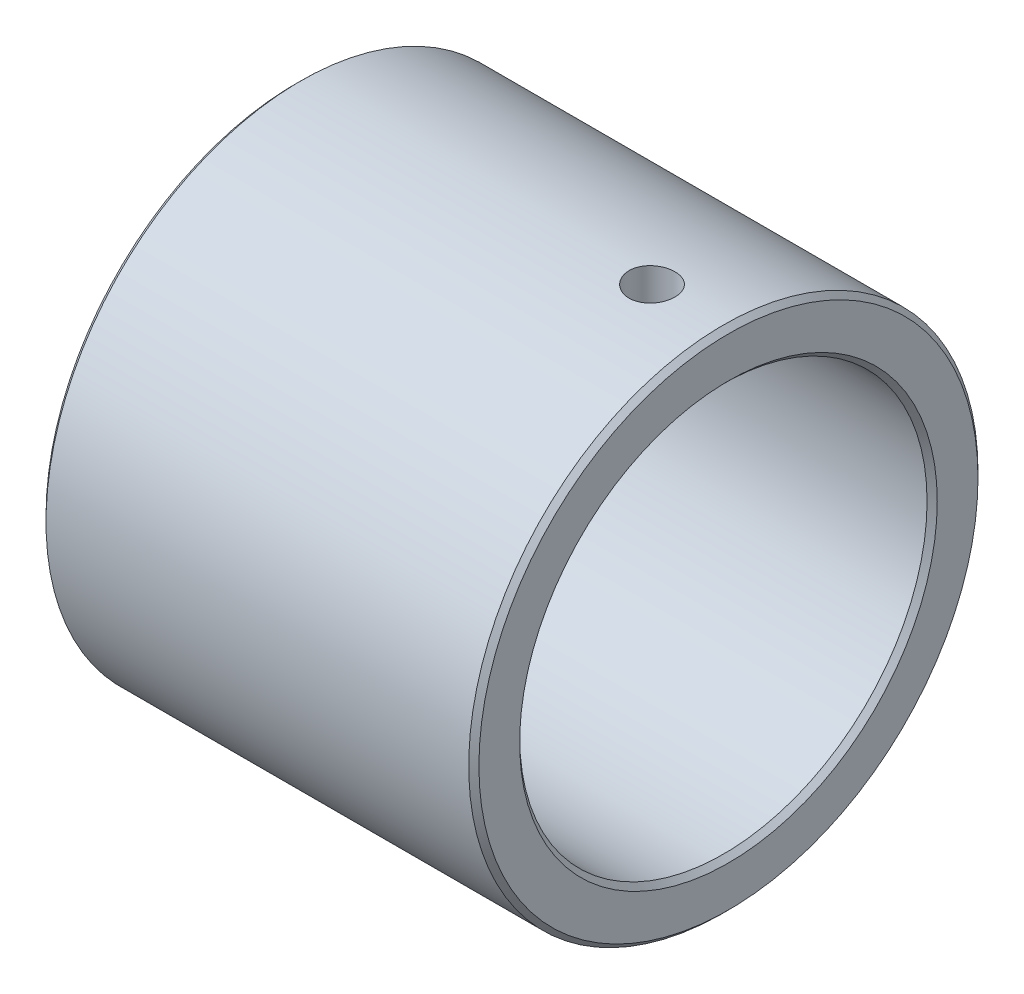
ISO-10303-21;
HEADER;
FILE_DESCRIPTION(('STEP AP214'),'2;1');
FILE_NAME('part.step','',(''),(''),'','','');
FILE_SCHEMA(('AUTOMOTIVE_DESIGN { 1 0 10303 214 1 1 1 1 }'));
ENDSEC;
DATA;
#1=APPLICATION_CONTEXT('core data for automotive mechanical design processes');
#2=APPLICATION_PROTOCOL_DEFINITION('international standard','automotive_design',2000,#1);
#3=PRODUCT_CONTEXT('',#1,'mechanical');
#4=PRODUCT('Part','Part','',(#3));
#5=PRODUCT_RELATED_PRODUCT_CATEGORY('part','',(#4));
#6=PRODUCT_DEFINITION_FORMATION('','',#4);
#7=PRODUCT_DEFINITION_CONTEXT('part definition',#1,'design');
#8=PRODUCT_DEFINITION('design','',#6,#7);
#9=PRODUCT_DEFINITION_SHAPE('','',#8);
#10=(LENGTH_UNIT() NAMED_UNIT(*) SI_UNIT(.MILLI.,.METRE.));
#11=(NAMED_UNIT(*) PLANE_ANGLE_UNIT() SI_UNIT($,.RADIAN.));
#12=(NAMED_UNIT(*) SI_UNIT($,.STERADIAN.) SOLID_ANGLE_UNIT());
#13=UNCERTAINTY_MEASURE_WITH_UNIT(LENGTH_MEASURE(1.E-05),#10,'distance_accuracy_value','');
#14=(GEOMETRIC_REPRESENTATION_CONTEXT(3) GLOBAL_UNCERTAINTY_ASSIGNED_CONTEXT((#13)) GLOBAL_UNIT_ASSIGNED_CONTEXT((#10,
#11,#12)) REPRESENTATION_CONTEXT('',''));
#15=CARTESIAN_POINT('',(0.,0.,0.));
#16=DIRECTION('',(0.,0.,1.));
#17=DIRECTION('',(1.,0.,0.));
#18=AXIS2_PLACEMENT_3D('',#15,#16,#17);
#19=CARTESIAN_POINT('',(85.,0.,0.));
#20=DIRECTION('',(1.,0.,0.));
#21=DIRECTION('',(0.,0.,-1.));
#22=AXIS2_PLACEMENT_3D('',#19,#20,#21);
#23=PLANE('',#22);
#24=CARTESIAN_POINT('',(85.,0.,0.));
#25=DIRECTION('',(1.,0.,0.));
#26=DIRECTION('',(0.,0.,-1.));
#27=AXIS2_PLACEMENT_3D('',#24,#25,#26);
#28=CIRCLE('',#27,41.);
#29=CARTESIAN_POINT('',(85.,0.,-41.));
#30=VERTEX_POINT('',#29);
#31=EDGE_CURVE('E64',#30,#30,#28,.F.);
#32=ORIENTED_EDGE('',*,*,#31,.T.);
#33=EDGE_LOOP('',(#32));
#34=FACE_BOUND('',#33,.T.);
#35=CARTESIAN_POINT('',(85.,0.,0.));
#36=DIRECTION('',(1.,0.,0.));
#37=DIRECTION('',(0.,0.,-1.));
#38=AXIS2_PLACEMENT_3D('',#35,#36,#37);
#39=CIRCLE('',#38,49.);
#40=CARTESIAN_POINT('',(85.,0.,-49.));
#41=VERTEX_POINT('',#40);
#42=EDGE_CURVE('E67',#41,#41,#39,.T.);
#43=ORIENTED_EDGE('',*,*,#42,.T.);
#44=EDGE_LOOP('',(#43));
#45=FACE_BOUND('',#44,.T.);
#46=ADVANCED_FACE('F36',(#34,#45),#23,.T.);
#47=CARTESIAN_POINT('',(0.,0.,0.));
#48=DIRECTION('',(1.,0.,0.));
#49=DIRECTION('',(0.,0.,-1.));
#50=AXIS2_PLACEMENT_3D('',#47,#48,#49);
#51=PLANE('',#50);
#52=CARTESIAN_POINT('',(0.,0.,0.));
#53=DIRECTION('',(1.,0.,0.));
#54=DIRECTION('',(0.,0.,-1.));
#55=AXIS2_PLACEMENT_3D('',#52,#53,#54);
#56=CIRCLE('',#55,41.);
#57=CARTESIAN_POINT('',(0.,0.,-41.));
#58=VERTEX_POINT('',#57);
#59=EDGE_CURVE('E48',#58,#58,#56,.T.);
#60=ORIENTED_EDGE('',*,*,#59,.T.);
#61=EDGE_LOOP('',(#60));
#62=FACE_BOUND('',#61,.T.);
#63=CARTESIAN_POINT('',(0.,0.,0.));
#64=DIRECTION('',(1.,0.,0.));
#65=DIRECTION('',(0.,0.,-1.));
#66=AXIS2_PLACEMENT_3D('',#63,#64,#65);
#67=CIRCLE('',#66,49.);
#68=CARTESIAN_POINT('',(0.,0.,-49.));
#69=VERTEX_POINT('',#68);
#70=EDGE_CURVE('E52',#69,#69,#67,.F.);
#71=ORIENTED_EDGE('',*,*,#70,.T.);
#72=EDGE_LOOP('',(#71));
#73=FACE_BOUND('',#72,.T.);
#74=ADVANCED_FACE('F97',(#62,#73),#51,.F.);
#75=CARTESIAN_POINT('',(85.,0.,0.));
#76=DIRECTION('',(-1.,0.,0.));
#77=DIRECTION('',(0.,0.,1.));
#78=AXIS2_PLACEMENT_3D('',#75,#76,#77);
#79=CYLINDRICAL_SURFACE('',#78,50.);
#80=CARTESIAN_POINT('',(70.,49.7970882682914,4.5));
#81=CARTESIAN_POINT('',(69.7477828195603,49.7970909455812,4.49998901574232));
#82=CARTESIAN_POINT('',(69.4953958003459,49.7990250856355,4.47872413144806));
#83=CARTESIAN_POINT('',(68.9976103851157,49.8065522178939,4.39421055062655));
#84=CARTESIAN_POINT('',(68.7522201479186,49.8121493128264,4.3309147758229));
#85=CARTESIAN_POINT('',(68.2757096128958,49.8263633291343,4.16418961108297));
#86=CARTESIAN_POINT('',(68.0445811034301,49.8349784933136,4.06078357060651));
#87=CARTESIAN_POINT('',(67.6030144210239,49.8542557537167,3.81681601803031));
#88=CARTESIAN_POINT('',(67.392571956222,49.8649174239781,3.67626223561904));
#89=CARTESIAN_POINT('',(66.9976726202033,49.8871219299917,3.36153887766235));
#90=CARTESIAN_POINT('',(66.8132857690383,49.8986670162332,3.18728159500766));
#91=CARTESIAN_POINT('',(66.4763338420713,49.9213169800203,2.81028416425305));
#92=CARTESIAN_POINT('',(66.3237701811293,49.9324218379756,2.60754275041835));
#93=CARTESIAN_POINT('',(66.054558454301,49.9529618480713,2.17890956671336));
#94=CARTESIAN_POINT('',(65.9379715789402,49.9623941440008,1.95297921637634));
#95=CARTESIAN_POINT('',(65.744414305935,49.9785019125345,1.48465011675435));
#96=CARTESIAN_POINT('',(65.6674431120665,49.9851774405456,1.24225169856712));
#97=CARTESIAN_POINT('',(65.5555053532911,49.9950037644823,0.748568945589706));
#98=CARTESIAN_POINT('',(65.5204247328265,49.9981641295322,0.497310665263049));
#99=CARTESIAN_POINT('',(65.4929112227566,50.0006365165153,-0.00754607600540508));
#100=CARTESIAN_POINT('',(65.5004774216505,49.9999486206984,-0.261144486815365));
#101=CARTESIAN_POINT('',(65.5579497617024,49.994809863503,-0.762709060147606));
#102=CARTESIAN_POINT('',(65.6077332563999,49.9903699024673,-1.01068940348989));
#103=CARTESIAN_POINT('',(65.7480361753584,49.9782387810855,-1.49476023342584));
#104=CARTESIAN_POINT('',(65.8385560414479,49.9705475854763,-1.73085059102927));
#105=CARTESIAN_POINT('',(66.0578980298907,49.9527602899161,-2.18482859855666));
#106=CARTESIAN_POINT('',(66.1867748322092,49.9426607608642,-2.40268968975519));
#107=CARTESIAN_POINT('',(66.4791326532763,49.9211911228025,-2.81373504263535));
#108=CARTESIAN_POINT('',(66.6426144924675,49.9098209836711,-3.0069187190718));
#109=CARTESIAN_POINT('',(67.0002324246755,49.8870396656629,-3.36384304597326));
#110=CARTESIAN_POINT('',(67.1944751351317,49.8756284841926,-3.52747689046139));
#111=CARTESIAN_POINT('',(67.6077301366836,49.8540916101512,-3.81983077722591));
#112=CARTESIAN_POINT('',(67.8267424534815,49.843965918914,-3.94855078327346));
#113=CARTESIAN_POINT('',(68.28339738582,49.8261450075227,-4.16742038049236));
#114=CARTESIAN_POINT('',(68.521042864644,49.818450161824,-4.2575640299911));
#115=CARTESIAN_POINT('',(69.008180655234,49.8063697201452,-4.39664093554174));
#116=CARTESIAN_POINT('',(69.2576726756576,49.8019840428272,-4.44557520450346));
#117=CARTESIAN_POINT('',(69.7604856369842,49.7970320779223,-4.50070825184742));
#118=CARTESIAN_POINT('',(70.0137901008338,49.7964524629098,-4.50705615366339));
#119=CARTESIAN_POINT('',(70.5178593926552,49.7991430787535,-4.47722727998323));
#120=CARTESIAN_POINT('',(70.7686242482929,49.8024132676251,-4.44105096823916));
#121=CARTESIAN_POINT('',(71.2600654409558,49.8124228855139,-4.32732506826713));
#122=CARTESIAN_POINT('',(71.5007580925942,49.8191564492455,-4.24984541990214));
#123=CARTESIAN_POINT('',(71.9657285327925,49.8353292982776,-4.05578342300488));
#124=CARTESIAN_POINT('',(72.1900060149798,49.8447686340626,-3.93920034487311));
#125=CARTESIAN_POINT('',(72.6164610858997,49.8653217543429,-3.66986493898665));
#126=CARTESIAN_POINT('',(72.8185758234097,49.8764400986335,-3.51701344834414));
#127=CARTESIAN_POINT('',(73.1943320782907,49.8990832599417,-3.17962291372337));
#128=CARTESIAN_POINT('',(73.3679730245549,49.9106080851065,-2.99508323431828));
#129=CARTESIAN_POINT('',(73.6823636620538,49.9328055522644,-2.59890935857889));
#130=CARTESIAN_POINT('',(73.823016314977,49.9434756207601,-2.38719799169619));
#131=CARTESIAN_POINT('',(74.0667712093004,49.9627241228052,-1.94307368821121));
#132=CARTESIAN_POINT('',(74.1698738792276,49.9713025802239,-1.71066098789389));
#133=CARTESIAN_POINT('',(74.3354362915076,49.9853895480291,-1.23207567066921));
#134=CARTESIAN_POINT('',(74.3979555109753,49.9909025492895,-0.985923766879016));
#135=CARTESIAN_POINT('',(74.4807706188012,49.9982557514571,-0.486564709330665));
#136=CARTESIAN_POINT('',(74.5010674527281,50.0000960346147,-0.233357713699715));
#137=CARTESIAN_POINT('',(74.4988497678809,49.9998965151497,0.271968690181564));
#138=CARTESIAN_POINT('',(74.476486253819,49.9978703984027,0.524088780234593));
#139=CARTESIAN_POINT('',(74.3898982516539,49.9901927601647,1.02097620257782));
#140=CARTESIAN_POINT('',(74.3256737149414,49.984541234464,1.26574352632959));
#141=CARTESIAN_POINT('',(74.1572265030108,49.9702465253009,1.74098291488919));
#142=CARTESIAN_POINT('',(74.0530072095183,49.9616035947806,1.97145618640612));
#143=CARTESIAN_POINT('',(73.8075456157773,49.9422916783682,2.41166020272996));
#144=CARTESIAN_POINT('',(73.66630376054,49.9316227168295,2.62139119681739));
#145=CARTESIAN_POINT('',(73.3502393049078,49.9094103145559,3.01493066715015));
#146=CARTESIAN_POINT('',(73.175304596354,49.8978640345863,3.1986489458303));
#147=CARTESIAN_POINT('',(72.7970315062044,49.8752225096701,3.53419603065372));
#148=CARTESIAN_POINT('',(72.5936862807516,49.8641273742345,3.68601713090311));
#149=CARTESIAN_POINT('',(72.1639058664326,49.8436189796934,3.95370258617575));
#150=CARTESIAN_POINT('',(71.9374225725904,49.8342093413342,4.06948991830313));
#151=CARTESIAN_POINT('',(71.468294885123,49.81818105121,4.26124167257795));
#152=CARTESIAN_POINT('',(71.2256692977527,49.8115592152928,4.33725155170795));
#153=CARTESIAN_POINT('',(70.8180280398378,49.8035468192985,4.42808437272771));
#154=CARTESIAN_POINT('',(70.6556284458143,49.8011361165538,4.45501650525101));
#155=CARTESIAN_POINT('',(70.3288433001838,49.7979059707615,4.49097787107928));
#156=CARTESIAN_POINT('',(70.1644577549992,49.7970865225693,4.50000716226529));
#157=CARTESIAN_POINT('',(70.,49.7970882682914,4.5));
#158=B_SPLINE_CURVE_WITH_KNOTS('',3,(#80,#81,#82,#83,#84,#85,#86,#87,#88,#89,#90,#91,#92,#93,
#94,#95,#96,#97,#98,#99,#100,#101,#102,#103,#104,#105,#106,#107,#108,#109,#110,#111,#112,#113,
#114,#115,#116,#117,#118,#119,#120,#121,#122,#123,#124,#125,#126,#127,#128,#129,#130,#131,#132,
#133,#134,#135,#136,#137,#138,#139,#140,#141,#142,#143,#144,#145,#146,#147,#148,#149,#150,#151,
#152,#153,#154,#155,#156,#157),.UNSPECIFIED.,.T.,.F.,(4,2,2,2,2,2,2,2,2,2,2,2,2,2,2,2,2,2,2,2,2,
2,2,2,2,2,2,2,2,2,2,2,2,2,2,2,2,2,4),(0.,0.756051036409277,1.51295034782219,2.26940970376489,
3.02571177967797,3.78400913614666,4.54234019935105,5.30195403752981,6.06155260785575,
6.81907826722582,7.57658773587787,8.33190405528276,9.08722856708215,9.84363503627465,
10.6000594409392,11.3591654365411,12.1182722198368,12.8774958815121,13.6367008812338,
14.3932460011032,15.1497828704706,15.9050427294221,16.6603166809449,17.4176799475392,
18.1750584029208,18.9346375756788,19.6942080797132,20.4526628660741,21.2111006666865,
21.9668588078972,22.7226178267002,23.4783129569611,24.2339990041803,24.9922443392693,
25.7506726452897,26.5107111453391,27.2698791793771,27.7628624800871,28.2558441869474),.UNSPECIFIED.);
#159=CARTESIAN_POINT('',(70.,49.7970882682914,4.5));
#160=VERTEX_POINT('',#159);
#161=EDGE_CURVE('E10',#160,#160,#158,.T.);
#162=ORIENTED_EDGE('',*,*,#161,.T.);
#163=EDGE_LOOP('',(#162));
#164=FACE_BOUND('',#163,.T.);
#165=CARTESIAN_POINT('',(84.,0.,0.));
#166=DIRECTION('',(1.,0.,0.));
#167=DIRECTION('',(0.,0.,-1.));
#168=AXIS2_PLACEMENT_3D('',#165,#166,#167);
#169=CIRCLE('',#168,50.);
#170=CARTESIAN_POINT('',(84.,0.,-50.));
#171=VERTEX_POINT('',#170);
#172=EDGE_CURVE('E56',#171,#171,#169,.F.);
#173=ORIENTED_EDGE('',*,*,#172,.T.);
#174=EDGE_LOOP('',(#173));
#175=FACE_BOUND('',#174,.T.);
#176=CARTESIAN_POINT('',(0.999999999999987,0.,0.));
#177=DIRECTION('',(1.,0.,0.));
#178=DIRECTION('',(0.,0.,-1.));
#179=AXIS2_PLACEMENT_3D('',#176,#177,#178);
#180=CIRCLE('',#179,50.);
#181=CARTESIAN_POINT('',(0.999999999999987,0.,-50.));
#182=VERTEX_POINT('',#181);
#183=EDGE_CURVE('E61',#182,#182,#180,.T.);
#184=ORIENTED_EDGE('',*,*,#183,.T.);
#185=EDGE_LOOP('',(#184));
#186=FACE_BOUND('',#185,.T.);
#187=ADVANCED_FACE('F102',(#164,#175,#186),#79,.T.);
#188=CARTESIAN_POINT('',(85.,0.,0.));
#189=DIRECTION('',(-1.,0.,0.));
#190=DIRECTION('',(0.,0.,1.));
#191=AXIS2_PLACEMENT_3D('',#188,#189,#190);
#192=CYLINDRICAL_SURFACE('',#191,40.);
#193=CARTESIAN_POINT('',(70.,39.7460689880144,4.5));
#194=CARTESIAN_POINT('',(69.7480926188938,39.7460722809675,4.49998917825949));
#195=CARTESIAN_POINT('',(69.4960229771268,39.748489672373,4.47877625254139));
#196=CARTESIAN_POINT('',(68.9988848780382,39.7578956183662,4.39448120169113));
#197=CARTESIAN_POINT('',(68.7538242432768,39.7648890871804,4.33135406402252));
#198=CARTESIAN_POINT('',(68.2779747072233,39.78264523958,4.16510299675445));
#199=CARTESIAN_POINT('',(68.047176775129,39.7934055087424,4.0620046831193));
#200=CARTESIAN_POINT('',(67.6062064077763,39.8174799139936,3.81878983536818));
#201=CARTESIAN_POINT('',(67.3960301563055,39.8307935762033,3.67868016829616));
#202=CARTESIAN_POINT('',(67.0012639129989,39.8585426774711,3.36473429269506));
#203=CARTESIAN_POINT('',(66.8167814407611,39.872982457982,3.1907632550704));
#204=CARTESIAN_POINT('',(66.4795668338649,39.9013175796803,2.8143223850519));
#205=CARTESIAN_POINT('',(66.3268362108361,39.9152128949215,2.6118511966031));
#206=CARTESIAN_POINT('',(66.0570816639941,39.9409371904276,2.18348961455327));
#207=CARTESIAN_POINT('',(65.940154039599,39.9527605619203,1.95753821230503));
#208=CARTESIAN_POINT('',(65.7459410235606,39.9729613010401,1.48905208848223));
#209=CARTESIAN_POINT('',(65.6686544277028,39.9813387733452,1.24651787091387));
#210=CARTESIAN_POINT('',(65.5562358287945,39.9936732692445,0.752844565905171));
#211=CARTESIAN_POINT('',(65.5209260254257,39.9976489325453,0.501746440034769));
#212=CARTESIAN_POINT('',(65.4929127611753,40.0007953857927,-0.00284099102516785));
#213=CARTESIAN_POINT('',(65.5002079251916,39.9999663308146,-0.256330218776751));
#214=CARTESIAN_POINT('',(65.5570540577609,39.993611930422,-0.757295958747963));
#215=CARTESIAN_POINT('',(65.6064138253628,39.9881078353656,-1.00479447445));
#216=CARTESIAN_POINT('',(65.7456896734463,39.9730459451045,-1.4879722825473));
#217=CARTESIAN_POINT('',(65.8356063984794,39.9634880854754,-1.72365138703642));
#218=CARTESIAN_POINT('',(66.053650406778,39.9413562943468,-2.17709791837234));
#219=CARTESIAN_POINT('',(66.1818614159301,39.9287757660532,-2.39482474980526));
#220=CARTESIAN_POINT('',(66.4727937123037,39.9020083420579,-2.80574336485208));
#221=CARTESIAN_POINT('',(66.635516281805,39.8878213866784,-2.99893423640394));
#222=CARTESIAN_POINT('',(66.9919258479528,39.859338397759,-3.35641847618246));
#223=CARTESIAN_POINT('',(67.1857793208684,39.8450421952271,-3.52054590000452));
#224=CARTESIAN_POINT('',(67.5983732375133,39.8180299561204,-3.81395718239763));
#225=CARTESIAN_POINT('',(67.8171137349708,39.8053139229572,-3.9432409657433));
#226=CARTESIAN_POINT('',(68.2734095826898,39.7829013351127,-4.16329911459418));
#227=CARTESIAN_POINT('',(68.5109706163176,39.7732056969136,-4.25406179461286));
#228=CARTESIAN_POINT('',(68.998094526414,39.75795018912,-4.39436254380214));
#229=CARTESIAN_POINT('',(69.2476569370431,39.7523901591374,-4.44390221170054));
#230=CARTESIAN_POINT('',(69.7502384786121,39.7460639865721,-4.50013425435024));
#231=CARTESIAN_POINT('',(70.0032312467523,39.7452717974205,-4.50705943541129));
#232=CARTESIAN_POINT('',(70.5067734525282,39.7485022035577,-4.47847867906871));
#233=CARTESIAN_POINT('',(70.7573229320668,39.7525247161264,-4.44297347065007));
#234=CARTESIAN_POINT('',(71.2481787954187,39.7649075674232,-4.33073516712147));
#235=CARTESIAN_POINT('',(71.4885109567526,39.7732561903548,-4.25411340236171));
#236=CARTESIAN_POINT('',(71.9529137336764,39.7933410975608,-4.06193109609873));
#237=CARTESIAN_POINT('',(72.1769838815997,39.8050774792129,-3.9463694352919));
#238=CARTESIAN_POINT('',(72.6035595426191,39.8306782716636,-3.67900961986329));
#239=CARTESIAN_POINT('',(72.8059682949104,39.8445516064736,-3.52705795036057));
#240=CARTESIAN_POINT('',(73.1824914429894,39.872834515189,-3.19145006614036));
#241=CARTESIAN_POINT('',(73.3566049500061,39.8872441059211,-3.00779285590587));
#242=CARTESIAN_POINT('',(73.6724050779625,39.9150552393907,-2.6129739360752));
#243=CARTESIAN_POINT('',(73.8139393013417,39.9284518552947,-2.4016899336736));
#244=CARTESIAN_POINT('',(74.0595118055827,39.9526549995581,-1.95821461424752));
#245=CARTESIAN_POINT('',(74.1635507167997,39.9634615714593,-1.7260236487841));
#246=CARTESIAN_POINT('',(74.3309241805024,39.9812449696974,-1.24784530374507));
#247=CARTESIAN_POINT('',(74.3943488952803,39.9882302740704,-1.00188981127613));
#248=CARTESIAN_POINT('',(74.4789874032245,39.9976190811227,-0.50273736314563));
#249=CARTESIAN_POINT('',(74.5002027206716,40.0000227492557,-0.249540669315888));
#250=CARTESIAN_POINT('',(74.4997954693064,39.9999770468032,0.255414218456674));
#251=CARTESIAN_POINT('',(74.4784087189358,39.9975543917223,0.507172637922325));
#252=CARTESIAN_POINT('',(74.393901265343,39.988181114428,1.00349461295482));
#253=CARTESIAN_POINT('',(74.3307805557501,39.9812304915233,1.24805816742337));
#254=CARTESIAN_POINT('',(74.1646665173412,39.9635793522078,1.72303237814413));
#255=CARTESIAN_POINT('',(74.0616822082705,39.9528796841273,1.95344622232853));
#256=CARTESIAN_POINT('',(73.8187888963582,39.9289193996405,2.3937569209739));
#257=CARTESIAN_POINT('',(73.6788797966084,39.9156587765132,2.6036537215864));
#258=CARTESIAN_POINT('',(73.3652288887195,39.8879718877799,2.998179427362));
#259=CARTESIAN_POINT('',(73.1913113725263,39.8735398064701,3.18266824065491));
#260=CARTESIAN_POINT('',(72.8149384631716,39.8451847012177,3.5199404239492));
#261=CARTESIAN_POINT('',(72.6124762775149,39.8312617994355,3.67271622606084));
#262=CARTESIAN_POINT('',(72.1840436997537,39.8054546300824,3.94262335178076));
#263=CARTESIAN_POINT('',(71.9580012172162,39.7935769269994,4.05964079948168));
#264=CARTESIAN_POINT('',(71.489476883966,39.7732824104026,4.25389605151972));
#265=CARTESIAN_POINT('',(71.2470136032194,39.7648617610648,4.33117796916226));
#266=CARTESIAN_POINT('',(70.83602615553,39.7545212512284,4.42485834861617));
#267=CARTESIAN_POINT('',(70.6701138440115,39.7513670140149,4.45299701866918));
#268=CARTESIAN_POINT('',(70.3361584362446,39.7471397895256,4.49057140215666));
#269=CARTESIAN_POINT('',(70.1681153521363,39.7460667903973,4.50000722210166));
#270=CARTESIAN_POINT('',(70.,39.7460689880144,4.5));
#271=B_SPLINE_CURVE_WITH_KNOTS('',3,(#193,#194,#195,#196,#197,#198,#199,#200,#201,#202,#203,
#204,#205,#206,#207,#208,#209,#210,#211,#212,#213,#214,#215,#216,#217,#218,#219,#220,#221,#222,
#223,#224,#225,#226,#227,#228,#229,#230,#231,#232,#233,#234,#235,#236,#237,#238,#239,#240,#241,
#242,#243,#244,#245,#246,#247,#248,#249,#250,#251,#252,#253,#254,#255,#256,#257,#258,#259,#260,
#261,#262,#263,#264,#265,#266,#267,#268,#269,#270),.UNSPECIFIED.,.T.,.F.,(4,2,2,2,2,2,2,2,2,2,2,
2,2,2,2,2,2,2,2,2,2,2,2,2,2,2,2,2,2,2,2,2,2,2,2,2,2,2,4),(0.,0.755108112794621,1.51102846622371,
2.26646517848916,3.02176182622297,3.78012981887575,4.53853390735551,5.29896031265103,
6.05936361635629,6.8165344861059,7.57368091782728,8.3274040517013,9.08113916454318,
9.83653444511983,10.5919577973853,11.351564318467,12.1111724794812,12.8710109053813,
13.6308198615417,14.3864742092959,15.1421155745447,15.8957211554878,16.6493484002127,
17.4062127072209,18.1631007832094,18.9234605265431,19.6838074864344,20.442460593049,
21.2010863024154,21.9555244023371,22.7099626174239,23.4642302290868,24.2184998203268,
24.976774612562,25.7352301495246,26.4960764764834,27.2560762987638,27.7600154396911,
28.2639517107362),.UNSPECIFIED.);
#272=CARTESIAN_POINT('',(70.,39.7460689880144,4.5));
#273=VERTEX_POINT('',#272);
#274=EDGE_CURVE('E76',#273,#273,#271,.T.);
#275=ORIENTED_EDGE('',*,*,#274,.F.);
#276=EDGE_LOOP('',(#275));
#277=FACE_BOUND('',#276,.T.);
#278=CARTESIAN_POINT('',(84.,0.,0.));
#279=DIRECTION('',(1.,0.,0.));
#280=DIRECTION('',(0.,0.,-1.));
#281=AXIS2_PLACEMENT_3D('',#278,#279,#280);
#282=CIRCLE('',#281,40.);
#283=CARTESIAN_POINT('',(84.,0.,-40.));
#284=VERTEX_POINT('',#283);
#285=EDGE_CURVE('E70',#284,#284,#282,.T.);
#286=ORIENTED_EDGE('',*,*,#285,.T.);
#287=EDGE_LOOP('',(#286));
#288=FACE_BOUND('',#287,.T.);
#289=CARTESIAN_POINT('',(0.999999999999987,0.,0.));
#290=DIRECTION('',(1.,0.,0.));
#291=DIRECTION('',(0.,0.,-1.));
#292=AXIS2_PLACEMENT_3D('',#289,#290,#291);
#293=CIRCLE('',#292,40.);
#294=CARTESIAN_POINT('',(0.999999999999987,0.,-40.));
#295=VERTEX_POINT('',#294);
#296=EDGE_CURVE('E73',#295,#295,#293,.F.);
#297=ORIENTED_EDGE('',*,*,#296,.T.);
#298=EDGE_LOOP('',(#297));
#299=FACE_BOUND('',#298,.T.);
#300=ADVANCED_FACE('F82',(#277,#288,#299),#192,.F.);
#301=CARTESIAN_POINT('',(84.,0.,0.));
#302=DIRECTION('',(1.,0.,0.));
#303=DIRECTION('',(0.,0.,-1.));
#304=AXIS2_PLACEMENT_3D('',#301,#302,#303);
#305=CONICAL_SURFACE('',#304,40.,0.785398163397445);
#306=ORIENTED_EDGE('',*,*,#31,.F.);
#307=EDGE_LOOP('',(#306));
#308=FACE_BOUND('',#307,.T.);
#309=ORIENTED_EDGE('',*,*,#285,.F.);
#310=EDGE_LOOP('',(#309));
#311=FACE_BOUND('',#310,.T.);
#312=ADVANCED_FACE('F108',(#308,#311),#305,.F.);
#313=CARTESIAN_POINT('',(85.,0.,0.));
#314=DIRECTION('',(-1.,0.,0.));
#315=DIRECTION('',(0.,0.,1.));
#316=AXIS2_PLACEMENT_3D('',#313,#314,#315);
#317=CONICAL_SURFACE('',#316,49.,0.785398163397438);
#318=ORIENTED_EDGE('',*,*,#172,.F.);
#319=EDGE_LOOP('',(#318));
#320=FACE_BOUND('',#319,.T.);
#321=ORIENTED_EDGE('',*,*,#42,.F.);
#322=EDGE_LOOP('',(#321));
#323=FACE_BOUND('',#322,.T.);
#324=ADVANCED_FACE('F111',(#320,#323),#317,.T.);
#325=CARTESIAN_POINT('',(0.,0.,0.));
#326=DIRECTION('',(-1.,0.,0.));
#327=DIRECTION('',(0.,0.,1.));
#328=AXIS2_PLACEMENT_3D('',#325,#326,#327);
#329=CONICAL_SURFACE('',#328,41.,0.785398163397459);
#330=ORIENTED_EDGE('',*,*,#296,.F.);
#331=EDGE_LOOP('',(#330));
#332=FACE_BOUND('',#331,.T.);
#333=ORIENTED_EDGE('',*,*,#59,.F.);
#334=EDGE_LOOP('',(#333));
#335=FACE_BOUND('',#334,.T.);
#336=ADVANCED_FACE('F93',(#332,#335),#329,.F.);
#337=CARTESIAN_POINT('',(0.999999999999987,0.,0.));
#338=DIRECTION('',(1.,0.,0.));
#339=DIRECTION('',(0.,0.,-1.));
#340=AXIS2_PLACEMENT_3D('',#337,#338,#339);
#341=CONICAL_SURFACE('',#340,50.,0.785398163397448);
#342=ORIENTED_EDGE('',*,*,#70,.F.);
#343=EDGE_LOOP('',(#342));
#344=FACE_BOUND('',#343,.T.);
#345=ORIENTED_EDGE('',*,*,#183,.F.);
#346=EDGE_LOOP('',(#345));
#347=FACE_BOUND('',#346,.T.);
#348=ADVANCED_FACE('F38',(#344,#347),#341,.T.);
#349=CARTESIAN_POINT('',(70.,50.,0.));
#350=DIRECTION('',(0.,1.,0.));
#351=DIRECTION('',(0.,0.,1.));
#352=AXIS2_PLACEMENT_3D('',#349,#350,#351);
#353=CYLINDRICAL_SURFACE('',#352,4.5);
#354=ORIENTED_EDGE('',*,*,#274,.T.);
#355=EDGE_LOOP('',(#354));
#356=FACE_BOUND('',#355,.T.);
#357=ORIENTED_EDGE('',*,*,#161,.F.);
#358=EDGE_LOOP('',(#357));
#359=FACE_BOUND('',#358,.T.);
#360=ADVANCED_FACE('F85',(#356,#359),#353,.F.);
#361=CLOSED_SHELL('',(#46,#74,#187,#300,#312,#324,#336,#348,#360));
#362=MANIFOLD_SOLID_BREP('B2',#361);
#363=ADVANCED_BREP_SHAPE_REPRESENTATION('',(#18,#362),#14);
#364=SHAPE_DEFINITION_REPRESENTATION(#9,#363);
ENDSEC;
END-ISO-10303-21;
